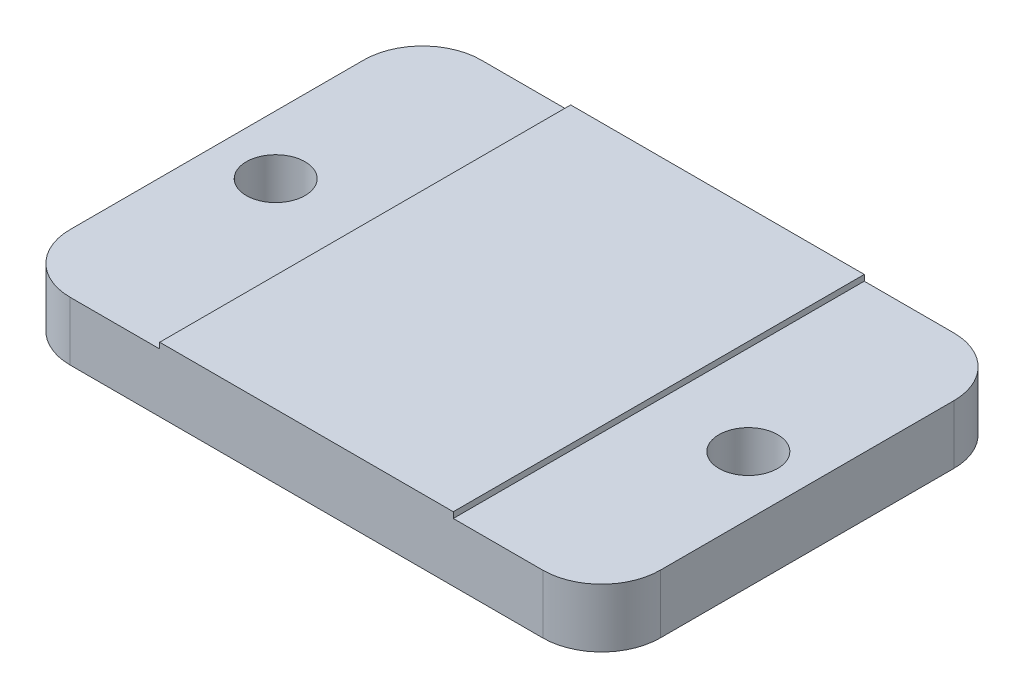
ISO-10303-21;
HEADER;
FILE_DESCRIPTION(('STEP AP214'),'2;1');
FILE_NAME('part.step','',(''),(''),'','','');
FILE_SCHEMA(('AUTOMOTIVE_DESIGN { 1 0 10303 214 1 1 1 1 }'));
ENDSEC;
DATA;
#1=APPLICATION_CONTEXT('core data for automotive mechanical design processes');
#2=APPLICATION_PROTOCOL_DEFINITION('international standard','automotive_design',2000,#1);
#3=PRODUCT_CONTEXT('',#1,'mechanical');
#4=PRODUCT('Part','Part','',(#3));
#5=PRODUCT_RELATED_PRODUCT_CATEGORY('part','',(#4));
#6=PRODUCT_DEFINITION_FORMATION('','',#4);
#7=PRODUCT_DEFINITION_CONTEXT('part definition',#1,'design');
#8=PRODUCT_DEFINITION('design','',#6,#7);
#9=PRODUCT_DEFINITION_SHAPE('','',#8);
#10=(LENGTH_UNIT() NAMED_UNIT(*) SI_UNIT(.MILLI.,.METRE.));
#11=(NAMED_UNIT(*) PLANE_ANGLE_UNIT() SI_UNIT($,.RADIAN.));
#12=(NAMED_UNIT(*) SI_UNIT($,.STERADIAN.) SOLID_ANGLE_UNIT());
#13=UNCERTAINTY_MEASURE_WITH_UNIT(LENGTH_MEASURE(1.E-05),#10,'distance_accuracy_value','');
#14=(GEOMETRIC_REPRESENTATION_CONTEXT(3) GLOBAL_UNCERTAINTY_ASSIGNED_CONTEXT((#13)) GLOBAL_UNIT_ASSIGNED_CONTEXT((#10,
#11,#12)) REPRESENTATION_CONTEXT('',''));
#15=CARTESIAN_POINT('',(0.,0.,0.));
#16=DIRECTION('',(0.,0.,1.));
#17=DIRECTION('',(1.,0.,0.));
#18=AXIS2_PLACEMENT_3D('',#15,#16,#17);
#19=CARTESIAN_POINT('',(0.,2.,0.));
#20=DIRECTION('',(0.,1.,0.));
#21=DIRECTION('',(0.,0.,1.));
#22=AXIS2_PLACEMENT_3D('',#19,#20,#21);
#23=PLANE('',#22);
#24=DIRECTION('',(1.,0.,0.));
#25=VECTOR('',#24,1.);
#26=CARTESIAN_POINT('',(-10.05,2.,7.));
#27=LINE('',#26,#25);
#28=CARTESIAN_POINT('',(5.,2.,7.));
#29=VERTEX_POINT('',#28);
#30=CARTESIAN_POINT('',(8.05,2.,7.));
#31=VERTEX_POINT('',#30);
#32=EDGE_CURVE('E198',#29,#31,#27,.T.);
#33=ORIENTED_EDGE('',*,*,#32,.T.);
#34=CARTESIAN_POINT('',(8.05,2.,5.));
#35=DIRECTION('',(0.,1.,0.));
#36=DIRECTION('',(0.,0.,1.));
#37=AXIS2_PLACEMENT_3D('',#34,#35,#36);
#38=CIRCLE('',#37,2.);
#39=CARTESIAN_POINT('',(10.05,2.,5.));
#40=VERTEX_POINT('',#39);
#41=EDGE_CURVE('E11',#31,#40,#38,.T.);
#42=ORIENTED_EDGE('',*,*,#41,.T.);
#43=DIRECTION('',(0.,0.,-1.));
#44=VECTOR('',#43,1.);
#45=CARTESIAN_POINT('',(10.05,2.,-7.));
#46=LINE('',#45,#44);
#47=CARTESIAN_POINT('',(10.05,2.,-5.));
#48=VERTEX_POINT('',#47);
#49=EDGE_CURVE('E186',#40,#48,#46,.T.);
#50=ORIENTED_EDGE('',*,*,#49,.T.);
#51=CARTESIAN_POINT('',(8.05,2.,-5.));
#52=DIRECTION('',(0.,1.,0.));
#53=DIRECTION('',(0.,0.,1.));
#54=AXIS2_PLACEMENT_3D('',#51,#52,#53);
#55=CIRCLE('',#54,2.);
#56=CARTESIAN_POINT('',(8.05,2.,-7.));
#57=VERTEX_POINT('',#56);
#58=EDGE_CURVE('E52',#48,#57,#55,.T.);
#59=ORIENTED_EDGE('',*,*,#58,.T.);
#60=DIRECTION('',(-1.,0.,0.));
#61=VECTOR('',#60,1.);
#62=CARTESIAN_POINT('',(-10.05,2.,-7.));
#63=LINE('',#62,#61);
#64=CARTESIAN_POINT('',(5.,2.,-7.));
#65=VERTEX_POINT('',#64);
#66=EDGE_CURVE('E191',#57,#65,#63,.T.);
#67=ORIENTED_EDGE('',*,*,#66,.T.);
#68=DIRECTION('',(0.,0.,-1.));
#69=VECTOR('',#68,1.);
#70=CARTESIAN_POINT('',(5.,2.,-7.));
#71=LINE('',#70,#69);
#72=EDGE_CURVE('E161',#29,#65,#71,.T.);
#73=ORIENTED_EDGE('',*,*,#72,.F.);
#74=EDGE_LOOP('',(#33,#42,#50,#59,#67,#73));
#75=FACE_BOUND('',#74,.T.);
#76=CARTESIAN_POINT('',(8.05,2.,0.));
#77=DIRECTION('',(0.,1.,0.));
#78=DIRECTION('',(0.,0.,-1.));
#79=AXIS2_PLACEMENT_3D('',#76,#77,#78);
#80=CIRCLE('',#79,1.);
#81=CARTESIAN_POINT('',(8.05,2.,-1.));
#82=VERTEX_POINT('',#81);
#83=EDGE_CURVE('E168',#82,#82,#80,.T.);
#84=ORIENTED_EDGE('',*,*,#83,.F.);
#85=EDGE_LOOP('',(#84));
#86=FACE_BOUND('',#85,.T.);
#87=ADVANCED_FACE('F43',(#75,#86),#23,.T.);
#88=DIRECTION('',(0.,0.,1.));
#89=VECTOR('',#88,1.);
#90=CARTESIAN_POINT('',(-10.05,2.,-7.));
#91=LINE('',#90,#89);
#92=CARTESIAN_POINT('',(-10.05,2.,-5.));
#93=VERTEX_POINT('',#92);
#94=CARTESIAN_POINT('',(-10.05,2.,5.));
#95=VERTEX_POINT('',#94);
#96=EDGE_CURVE('E194',#93,#95,#91,.T.);
#97=ORIENTED_EDGE('',*,*,#96,.T.);
#98=CARTESIAN_POINT('',(-8.05,2.,5.));
#99=DIRECTION('',(0.,1.,0.));
#100=DIRECTION('',(0.,0.,1.));
#101=AXIS2_PLACEMENT_3D('',#98,#99,#100);
#102=CIRCLE('',#101,2.);
#103=CARTESIAN_POINT('',(-8.05,2.,7.));
#104=VERTEX_POINT('',#103);
#105=EDGE_CURVE('E243',#95,#104,#102,.T.);
#106=ORIENTED_EDGE('',*,*,#105,.T.);
#107=CARTESIAN_POINT('',(-5.,2.,7.));
#108=VERTEX_POINT('',#107);
#109=EDGE_CURVE('E199',#104,#108,#27,.T.);
#110=ORIENTED_EDGE('',*,*,#109,.T.);
#111=DIRECTION('',(0.,0.,1.));
#112=VECTOR('',#111,1.);
#113=CARTESIAN_POINT('',(-5.,2.,-7.));
#114=LINE('',#113,#112);
#115=CARTESIAN_POINT('',(-5.,2.,-7.));
#116=VERTEX_POINT('',#115);
#117=EDGE_CURVE('E158',#116,#108,#114,.T.);
#118=ORIENTED_EDGE('',*,*,#117,.F.);
#119=CARTESIAN_POINT('',(-8.05,2.,-7.));
#120=VERTEX_POINT('',#119);
#121=EDGE_CURVE('E189',#116,#120,#63,.T.);
#122=ORIENTED_EDGE('',*,*,#121,.T.);
#123=CARTESIAN_POINT('',(-8.05,2.,-5.));
#124=DIRECTION('',(0.,1.,0.));
#125=DIRECTION('',(0.,0.,1.));
#126=AXIS2_PLACEMENT_3D('',#123,#124,#125);
#127=CIRCLE('',#126,2.);
#128=EDGE_CURVE('E240',#120,#93,#127,.T.);
#129=ORIENTED_EDGE('',*,*,#128,.T.);
#130=EDGE_LOOP('',(#97,#106,#110,#118,#122,#129));
#131=FACE_BOUND('',#130,.T.);
#132=CARTESIAN_POINT('',(-8.05,2.,0.));
#133=DIRECTION('',(0.,1.,0.));
#134=DIRECTION('',(0.,0.,1.));
#135=AXIS2_PLACEMENT_3D('',#132,#133,#134);
#136=CIRCLE('',#135,1.);
#137=CARTESIAN_POINT('',(-8.05,2.,1.));
#138=VERTEX_POINT('',#137);
#139=EDGE_CURVE('E178',#138,#138,#136,.T.);
#140=ORIENTED_EDGE('',*,*,#139,.F.);
#141=EDGE_LOOP('',(#140));
#142=FACE_BOUND('',#141,.T.);
#143=ADVANCED_FACE('F295',(#131,#142),#23,.T.);
#144=CARTESIAN_POINT('',(0.,0.,0.));
#145=DIRECTION('',(0.,1.,0.));
#146=DIRECTION('',(0.,0.,1.));
#147=AXIS2_PLACEMENT_3D('',#144,#145,#146);
#148=PLANE('',#147);
#149=DIRECTION('',(1.,0.,0.));
#150=VECTOR('',#149,1.);
#151=CARTESIAN_POINT('',(-10.05,0.,7.));
#152=LINE('',#151,#150);
#153=CARTESIAN_POINT('',(-8.05,0.,7.));
#154=VERTEX_POINT('',#153);
#155=CARTESIAN_POINT('',(8.05,0.,7.));
#156=VERTEX_POINT('',#155);
#157=EDGE_CURVE('E190',#154,#156,#152,.T.);
#158=ORIENTED_EDGE('',*,*,#157,.F.);
#159=CARTESIAN_POINT('',(-8.05,0.,5.));
#160=DIRECTION('',(0.,1.,0.));
#161=DIRECTION('',(0.,0.,1.));
#162=AXIS2_PLACEMENT_3D('',#159,#160,#161);
#163=CIRCLE('',#162,2.);
#164=CARTESIAN_POINT('',(-10.05,0.,5.));
#165=VERTEX_POINT('',#164);
#166=EDGE_CURVE('E230',#154,#165,#163,.F.);
#167=ORIENTED_EDGE('',*,*,#166,.T.);
#168=DIRECTION('',(0.,0.,1.));
#169=VECTOR('',#168,1.);
#170=CARTESIAN_POINT('',(-10.05,0.,-7.));
#171=LINE('',#170,#169);
#172=CARTESIAN_POINT('',(-10.05,0.,-5.));
#173=VERTEX_POINT('',#172);
#174=EDGE_CURVE('E208',#173,#165,#171,.T.);
#175=ORIENTED_EDGE('',*,*,#174,.F.);
#176=CARTESIAN_POINT('',(-8.05,0.,-5.));
#177=DIRECTION('',(0.,1.,0.));
#178=DIRECTION('',(0.,0.,1.));
#179=AXIS2_PLACEMENT_3D('',#176,#177,#178);
#180=CIRCLE('',#179,2.);
#181=CARTESIAN_POINT('',(-8.05,0.,-7.));
#182=VERTEX_POINT('',#181);
#183=EDGE_CURVE('E227',#173,#182,#180,.F.);
#184=ORIENTED_EDGE('',*,*,#183,.T.);
#185=DIRECTION('',(-1.,0.,0.));
#186=VECTOR('',#185,1.);
#187=CARTESIAN_POINT('',(-10.05,0.,-7.));
#188=LINE('',#187,#186);
#189=CARTESIAN_POINT('',(8.05,0.,-7.));
#190=VERTEX_POINT('',#189);
#191=EDGE_CURVE('E205',#190,#182,#188,.T.);
#192=ORIENTED_EDGE('',*,*,#191,.F.);
#193=CARTESIAN_POINT('',(8.05,0.,-5.));
#194=DIRECTION('',(0.,1.,0.));
#195=DIRECTION('',(0.,0.,1.));
#196=AXIS2_PLACEMENT_3D('',#193,#194,#195);
#197=CIRCLE('',#196,2.);
#198=CARTESIAN_POINT('',(10.05,0.,-5.));
#199=VERTEX_POINT('',#198);
#200=EDGE_CURVE('E221',#190,#199,#197,.F.);
#201=ORIENTED_EDGE('',*,*,#200,.T.);
#202=DIRECTION('',(0.,0.,-1.));
#203=VECTOR('',#202,1.);
#204=CARTESIAN_POINT('',(10.05,0.,-7.));
#205=LINE('',#204,#203);
#206=CARTESIAN_POINT('',(10.05,0.,5.));
#207=VERTEX_POINT('',#206);
#208=EDGE_CURVE('E182',#207,#199,#205,.T.);
#209=ORIENTED_EDGE('',*,*,#208,.F.);
#210=CARTESIAN_POINT('',(8.05,0.,5.));
#211=DIRECTION('',(0.,1.,0.));
#212=DIRECTION('',(0.,0.,1.));
#213=AXIS2_PLACEMENT_3D('',#210,#211,#212);
#214=CIRCLE('',#213,2.);
#215=EDGE_CURVE('E224',#207,#156,#214,.F.);
#216=ORIENTED_EDGE('',*,*,#215,.T.);
#217=EDGE_LOOP('',(#158,#167,#175,#184,#192,#201,#209,#216));
#218=FACE_BOUND('',#217,.T.);
#219=CARTESIAN_POINT('',(-8.05,0.,0.));
#220=DIRECTION('',(0.,1.,0.));
#221=DIRECTION('',(0.,0.,1.));
#222=AXIS2_PLACEMENT_3D('',#219,#220,#221);
#223=CIRCLE('',#222,1.);
#224=CARTESIAN_POINT('',(-8.05,0.,1.));
#225=VERTEX_POINT('',#224);
#226=EDGE_CURVE('E176',#225,#225,#223,.T.);
#227=ORIENTED_EDGE('',*,*,#226,.T.);
#228=EDGE_LOOP('',(#227));
#229=FACE_BOUND('',#228,.T.);
#230=CARTESIAN_POINT('',(8.05,0.,0.));
#231=DIRECTION('',(0.,1.,0.));
#232=DIRECTION('',(0.,0.,-1.));
#233=AXIS2_PLACEMENT_3D('',#230,#231,#232);
#234=CIRCLE('',#233,1.);
#235=CARTESIAN_POINT('',(8.05,0.,-1.));
#236=VERTEX_POINT('',#235);
#237=EDGE_CURVE('E163',#236,#236,#234,.T.);
#238=ORIENTED_EDGE('',*,*,#237,.T.);
#239=EDGE_LOOP('',(#238));
#240=FACE_BOUND('',#239,.T.);
#241=ADVANCED_FACE('F267',(#218,#229,#240),#148,.F.);
#242=CARTESIAN_POINT('',(10.05,2.,-7.));
#243=DIRECTION('',(-1.,0.,0.));
#244=DIRECTION('',(0.,0.,1.));
#245=AXIS2_PLACEMENT_3D('',#242,#243,#244);
#246=PLANE('',#245);
#247=ORIENTED_EDGE('',*,*,#49,.F.);
#248=DIRECTION('',(0.,-1.,0.));
#249=VECTOR('',#248,1.);
#250=CARTESIAN_POINT('',(10.05,2.,5.));
#251=LINE('',#250,#249);
#252=EDGE_CURVE('E255',#40,#207,#251,.T.);
#253=ORIENTED_EDGE('',*,*,#252,.T.);
#254=ORIENTED_EDGE('',*,*,#208,.T.);
#255=DIRECTION('',(0.,-1.,0.));
#256=VECTOR('',#255,1.);
#257=CARTESIAN_POINT('',(10.05,2.,-5.));
#258=LINE('',#257,#256);
#259=EDGE_CURVE('E59',#199,#48,#258,.F.);
#260=ORIENTED_EDGE('',*,*,#259,.T.);
#261=EDGE_LOOP('',(#247,#253,#254,#260));
#262=FACE_BOUND('',#261,.T.);
#263=ADVANCED_FACE('F269',(#262),#246,.F.);
#264=CARTESIAN_POINT('',(-10.05,2.,-7.));
#265=DIRECTION('',(0.,0.,1.));
#266=DIRECTION('',(1.,0.,0.));
#267=AXIS2_PLACEMENT_3D('',#264,#265,#266);
#268=PLANE('',#267);
#269=ORIENTED_EDGE('',*,*,#191,.T.);
#270=DIRECTION('',(0.,-1.,0.));
#271=VECTOR('',#270,1.);
#272=CARTESIAN_POINT('',(-8.05,2.,-7.));
#273=LINE('',#272,#271);
#274=EDGE_CURVE('E250',#182,#120,#273,.F.);
#275=ORIENTED_EDGE('',*,*,#274,.T.);
#276=ORIENTED_EDGE('',*,*,#121,.F.);
#277=DIRECTION('',(0.,-1.,0.));
#278=VECTOR('',#277,1.);
#279=CARTESIAN_POINT('',(-5.,2.2,-7.));
#280=LINE('',#279,#278);
#281=CARTESIAN_POINT('',(-5.,2.2,-7.));
#282=VERTEX_POINT('',#281);
#283=EDGE_CURVE('E143',#282,#116,#280,.T.);
#284=ORIENTED_EDGE('',*,*,#283,.F.);
#285=DIRECTION('',(-1.,0.,0.));
#286=VECTOR('',#285,1.);
#287=CARTESIAN_POINT('',(-5.,2.2,-7.));
#288=LINE('',#287,#286);
#289=CARTESIAN_POINT('',(5.,2.2,-7.));
#290=VERTEX_POINT('',#289);
#291=EDGE_CURVE('E133',#290,#282,#288,.T.);
#292=ORIENTED_EDGE('',*,*,#291,.F.);
#293=DIRECTION('',(0.,-1.,0.));
#294=VECTOR('',#293,1.);
#295=CARTESIAN_POINT('',(5.,2.2,-7.));
#296=LINE('',#295,#294);
#297=EDGE_CURVE('E139',#290,#65,#296,.T.);
#298=ORIENTED_EDGE('',*,*,#297,.T.);
#299=ORIENTED_EDGE('',*,*,#66,.F.);
#300=DIRECTION('',(0.,-1.,0.));
#301=VECTOR('',#300,1.);
#302=CARTESIAN_POINT('',(8.05,2.,-7.));
#303=LINE('',#302,#301);
#304=EDGE_CURVE('E246',#57,#190,#303,.T.);
#305=ORIENTED_EDGE('',*,*,#304,.T.);
#306=EDGE_LOOP('',(#269,#275,#276,#284,#292,#298,#299,#305));
#307=FACE_BOUND('',#306,.T.);
#308=ADVANCED_FACE('F136',(#307),#268,.F.);
#309=CARTESIAN_POINT('',(-10.05,2.,-7.));
#310=DIRECTION('',(1.,0.,0.));
#311=DIRECTION('',(0.,0.,-1.));
#312=AXIS2_PLACEMENT_3D('',#309,#310,#311);
#313=PLANE('',#312);
#314=ORIENTED_EDGE('',*,*,#174,.T.);
#315=DIRECTION('',(0.,-1.,0.));
#316=VECTOR('',#315,1.);
#317=CARTESIAN_POINT('',(-10.05,2.,5.));
#318=LINE('',#317,#316);
#319=EDGE_CURVE('E237',#165,#95,#318,.F.);
#320=ORIENTED_EDGE('',*,*,#319,.T.);
#321=ORIENTED_EDGE('',*,*,#96,.F.);
#322=DIRECTION('',(0.,-1.,0.));
#323=VECTOR('',#322,1.);
#324=CARTESIAN_POINT('',(-10.05,2.,-5.));
#325=LINE('',#324,#323);
#326=EDGE_CURVE('E233',#93,#173,#325,.T.);
#327=ORIENTED_EDGE('',*,*,#326,.T.);
#328=EDGE_LOOP('',(#314,#320,#321,#327));
#329=FACE_BOUND('',#328,.T.);
#330=ADVANCED_FACE('F286',(#329),#313,.F.);
#331=CARTESIAN_POINT('',(-10.05,2.,7.));
#332=DIRECTION('',(0.,0.,-1.));
#333=DIRECTION('',(-1.,0.,0.));
#334=AXIS2_PLACEMENT_3D('',#331,#332,#333);
#335=PLANE('',#334);
#336=ORIENTED_EDGE('',*,*,#109,.F.);
#337=DIRECTION('',(0.,-1.,0.));
#338=VECTOR('',#337,1.);
#339=CARTESIAN_POINT('',(-8.05,2.,7.));
#340=LINE('',#339,#338);
#341=EDGE_CURVE('E217',#104,#154,#340,.T.);
#342=ORIENTED_EDGE('',*,*,#341,.T.);
#343=ORIENTED_EDGE('',*,*,#157,.T.);
#344=DIRECTION('',(0.,-1.,0.));
#345=VECTOR('',#344,1.);
#346=CARTESIAN_POINT('',(8.05,2.,7.));
#347=LINE('',#346,#345);
#348=EDGE_CURVE('E202',#156,#31,#347,.F.);
#349=ORIENTED_EDGE('',*,*,#348,.T.);
#350=ORIENTED_EDGE('',*,*,#32,.F.);
#351=DIRECTION('',(0.,-1.,0.));
#352=VECTOR('',#351,1.);
#353=CARTESIAN_POINT('',(5.,2.2,7.));
#354=LINE('',#353,#352);
#355=CARTESIAN_POINT('',(5.,2.2,7.));
#356=VERTEX_POINT('',#355);
#357=EDGE_CURVE('E300',#356,#29,#354,.T.);
#358=ORIENTED_EDGE('',*,*,#357,.F.);
#359=DIRECTION('',(1.,0.,0.));
#360=VECTOR('',#359,1.);
#361=CARTESIAN_POINT('',(-5.,2.2,7.));
#362=LINE('',#361,#360);
#363=CARTESIAN_POINT('',(-5.,2.2,7.));
#364=VERTEX_POINT('',#363);
#365=EDGE_CURVE('E153',#364,#356,#362,.T.);
#366=ORIENTED_EDGE('',*,*,#365,.F.);
#367=DIRECTION('',(0.,-1.,0.));
#368=VECTOR('',#367,1.);
#369=CARTESIAN_POINT('',(-5.,2.2,7.));
#370=LINE('',#369,#368);
#371=EDGE_CURVE('E170',#364,#108,#370,.T.);
#372=ORIENTED_EDGE('',*,*,#371,.T.);
#373=EDGE_LOOP('',(#336,#342,#343,#349,#350,#358,#366,#372));
#374=FACE_BOUND('',#373,.T.);
#375=ADVANCED_FACE('F276',(#374),#335,.F.);
#376=CARTESIAN_POINT('',(-8.05,2.,0.));
#377=DIRECTION('',(0.,-1.,0.));
#378=DIRECTION('',(0.,0.,-1.));
#379=AXIS2_PLACEMENT_3D('',#376,#377,#378);
#380=CYLINDRICAL_SURFACE('',#379,1.);
#381=ORIENTED_EDGE('',*,*,#139,.T.);
#382=EDGE_LOOP('',(#381));
#383=FACE_BOUND('',#382,.T.);
#384=ORIENTED_EDGE('',*,*,#226,.F.);
#385=EDGE_LOOP('',(#384));
#386=FACE_BOUND('',#385,.T.);
#387=ADVANCED_FACE('F331',(#383,#386),#380,.F.);
#388=CARTESIAN_POINT('',(8.05,2.,0.));
#389=DIRECTION('',(0.,-1.,0.));
#390=DIRECTION('',(0.,0.,-1.));
#391=AXIS2_PLACEMENT_3D('',#388,#389,#390);
#392=CYLINDRICAL_SURFACE('',#391,1.);
#393=ORIENTED_EDGE('',*,*,#83,.T.);
#394=EDGE_LOOP('',(#393));
#395=FACE_BOUND('',#394,.T.);
#396=ORIENTED_EDGE('',*,*,#237,.F.);
#397=EDGE_LOOP('',(#396));
#398=FACE_BOUND('',#397,.T.);
#399=ADVANCED_FACE('F322',(#395,#398),#392,.F.);
#400=CARTESIAN_POINT('',(5.,2.2,-7.));
#401=DIRECTION('',(-1.,0.,0.));
#402=DIRECTION('',(0.,0.,1.));
#403=AXIS2_PLACEMENT_3D('',#400,#401,#402);
#404=PLANE('',#403);
#405=ORIENTED_EDGE('',*,*,#72,.T.);
#406=ORIENTED_EDGE('',*,*,#297,.F.);
#407=DIRECTION('',(0.,0.,-1.));
#408=VECTOR('',#407,1.);
#409=CARTESIAN_POINT('',(5.,2.2,-7.));
#410=LINE('',#409,#408);
#411=EDGE_CURVE('E148',#356,#290,#410,.T.);
#412=ORIENTED_EDGE('',*,*,#411,.F.);
#413=ORIENTED_EDGE('',*,*,#357,.T.);
#414=EDGE_LOOP('',(#405,#406,#412,#413));
#415=FACE_BOUND('',#414,.T.);
#416=ADVANCED_FACE('F160',(#415),#404,.F.);
#417=CARTESIAN_POINT('',(-5.,2.2,-7.));
#418=DIRECTION('',(1.,0.,0.));
#419=DIRECTION('',(0.,0.,-1.));
#420=AXIS2_PLACEMENT_3D('',#417,#418,#419);
#421=PLANE('',#420);
#422=ORIENTED_EDGE('',*,*,#117,.T.);
#423=ORIENTED_EDGE('',*,*,#371,.F.);
#424=DIRECTION('',(0.,0.,1.));
#425=VECTOR('',#424,1.);
#426=CARTESIAN_POINT('',(-5.,2.2,-7.));
#427=LINE('',#426,#425);
#428=EDGE_CURVE('E147',#282,#364,#427,.T.);
#429=ORIENTED_EDGE('',*,*,#428,.F.);
#430=ORIENTED_EDGE('',*,*,#283,.T.);
#431=EDGE_LOOP('',(#422,#423,#429,#430));
#432=FACE_BOUND('',#431,.T.);
#433=ADVANCED_FACE('F314',(#432),#421,.F.);
#434=CARTESIAN_POINT('',(0.,2.2,0.));
#435=DIRECTION('',(0.,1.,0.));
#436=DIRECTION('',(0.,0.,1.));
#437=AXIS2_PLACEMENT_3D('',#434,#435,#436);
#438=PLANE('',#437);
#439=ORIENTED_EDGE('',*,*,#411,.T.);
#440=ORIENTED_EDGE('',*,*,#291,.T.);
#441=ORIENTED_EDGE('',*,*,#428,.T.);
#442=ORIENTED_EDGE('',*,*,#365,.T.);
#443=EDGE_LOOP('',(#439,#440,#441,#442));
#444=FACE_BOUND('',#443,.T.);
#445=ADVANCED_FACE('F151',(#444),#438,.T.);
#446=CARTESIAN_POINT('',(-8.05,2.,5.));
#447=DIRECTION('',(0.,-1.,0.));
#448=DIRECTION('',(0.,0.,-1.));
#449=AXIS2_PLACEMENT_3D('',#446,#447,#448);
#450=CYLINDRICAL_SURFACE('',#449,2.);
#451=ORIENTED_EDGE('',*,*,#105,.F.);
#452=ORIENTED_EDGE('',*,*,#319,.F.);
#453=ORIENTED_EDGE('',*,*,#166,.F.);
#454=ORIENTED_EDGE('',*,*,#341,.F.);
#455=EDGE_LOOP('',(#451,#452,#453,#454));
#456=FACE_BOUND('',#455,.T.);
#457=ADVANCED_FACE('F282',(#456),#450,.T.);
#458=CARTESIAN_POINT('',(-8.05,2.,-5.));
#459=DIRECTION('',(0.,-1.,0.));
#460=DIRECTION('',(0.,0.,-1.));
#461=AXIS2_PLACEMENT_3D('',#458,#459,#460);
#462=CYLINDRICAL_SURFACE('',#461,2.);
#463=ORIENTED_EDGE('',*,*,#128,.F.);
#464=ORIENTED_EDGE('',*,*,#274,.F.);
#465=ORIENTED_EDGE('',*,*,#183,.F.);
#466=ORIENTED_EDGE('',*,*,#326,.F.);
#467=EDGE_LOOP('',(#463,#464,#465,#466));
#468=FACE_BOUND('',#467,.T.);
#469=ADVANCED_FACE('F291',(#468),#462,.T.);
#470=CARTESIAN_POINT('',(8.05,2.,5.));
#471=DIRECTION('',(0.,-1.,0.));
#472=DIRECTION('',(0.,0.,-1.));
#473=AXIS2_PLACEMENT_3D('',#470,#471,#472);
#474=CYLINDRICAL_SURFACE('',#473,2.);
#475=ORIENTED_EDGE('',*,*,#41,.F.);
#476=ORIENTED_EDGE('',*,*,#348,.F.);
#477=ORIENTED_EDGE('',*,*,#215,.F.);
#478=ORIENTED_EDGE('',*,*,#252,.F.);
#479=EDGE_LOOP('',(#475,#476,#477,#478));
#480=FACE_BOUND('',#479,.T.);
#481=ADVANCED_FACE('F272',(#480),#474,.T.);
#482=CARTESIAN_POINT('',(8.05,2.,-5.));
#483=DIRECTION('',(0.,-1.,0.));
#484=DIRECTION('',(0.,0.,-1.));
#485=AXIS2_PLACEMENT_3D('',#482,#483,#484);
#486=CYLINDRICAL_SURFACE('',#485,2.);
#487=ORIENTED_EDGE('',*,*,#58,.F.);
#488=ORIENTED_EDGE('',*,*,#259,.F.);
#489=ORIENTED_EDGE('',*,*,#200,.F.);
#490=ORIENTED_EDGE('',*,*,#304,.F.);
#491=EDGE_LOOP('',(#487,#488,#489,#490));
#492=FACE_BOUND('',#491,.T.);
#493=ADVANCED_FACE('F45',(#492),#486,.T.);
#494=CLOSED_SHELL('',(#87,#143,#241,#263,#308,#330,#375,#387,#399,#416,#433,#445,#457,#469,#481,#493));
#495=MANIFOLD_SOLID_BREP('B2',#494);
#496=ADVANCED_BREP_SHAPE_REPRESENTATION('',(#18,#495),#14);
#497=SHAPE_DEFINITION_REPRESENTATION(#9,#496);
ENDSEC;
END-ISO-10303-21;
